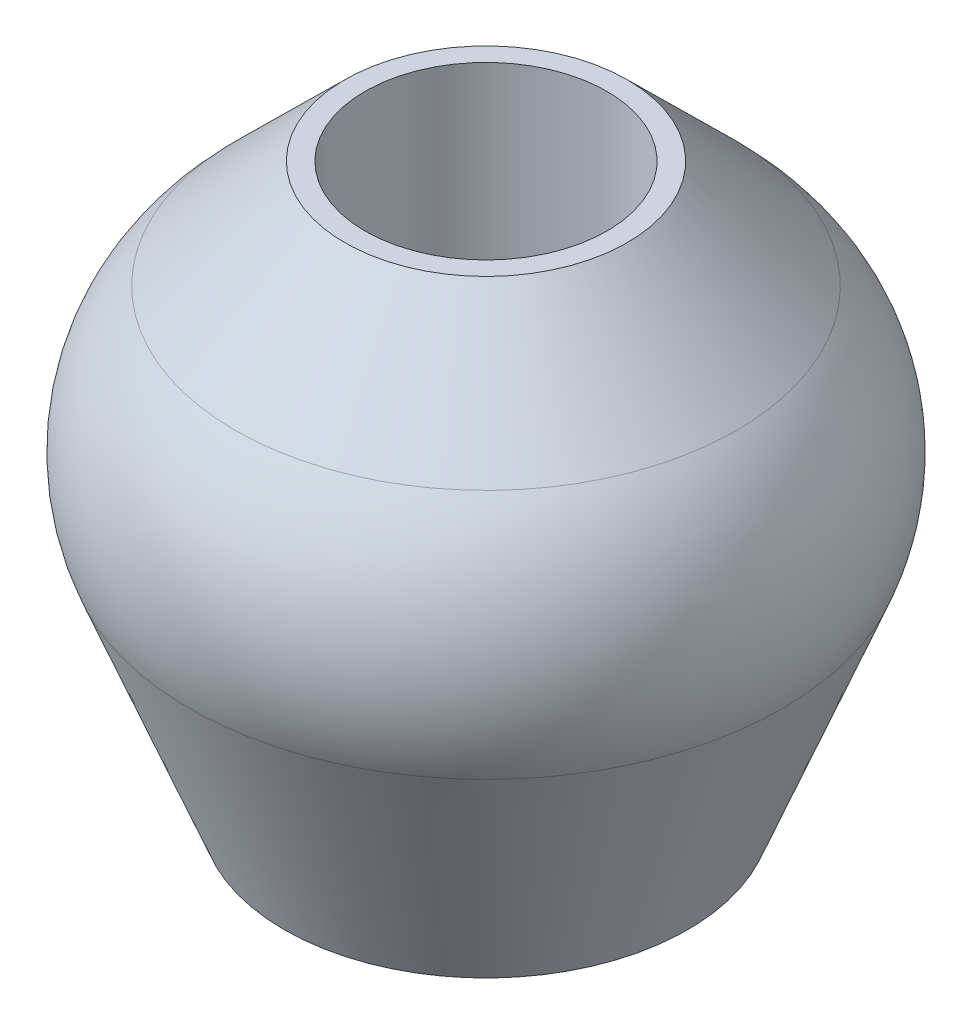
ISO-10303-21;
HEADER;
FILE_DESCRIPTION(('STEP AP214'),'2;1');
FILE_NAME('part.step','',(''),(''),'','','');
FILE_SCHEMA(('AUTOMOTIVE_DESIGN { 1 0 10303 214 1 1 1 1 }'));
ENDSEC;
DATA;
#1=APPLICATION_CONTEXT('core data for automotive mechanical design processes');
#2=APPLICATION_PROTOCOL_DEFINITION('international standard','automotive_design',2000,#1);
#3=PRODUCT_CONTEXT('',#1,'mechanical');
#4=PRODUCT('Part','Part','',(#3));
#5=PRODUCT_RELATED_PRODUCT_CATEGORY('part','',(#4));
#6=PRODUCT_DEFINITION_FORMATION('','',#4);
#7=PRODUCT_DEFINITION_CONTEXT('part definition',#1,'design');
#8=PRODUCT_DEFINITION('design','',#6,#7);
#9=PRODUCT_DEFINITION_SHAPE('','',#8);
#10=(LENGTH_UNIT() NAMED_UNIT(*) SI_UNIT(.MILLI.,.METRE.));
#11=(NAMED_UNIT(*) PLANE_ANGLE_UNIT() SI_UNIT($,.RADIAN.));
#12=(NAMED_UNIT(*) SI_UNIT($,.STERADIAN.) SOLID_ANGLE_UNIT());
#13=UNCERTAINTY_MEASURE_WITH_UNIT(LENGTH_MEASURE(1.E-05),#10,'distance_accuracy_value','');
#14=(GEOMETRIC_REPRESENTATION_CONTEXT(3) GLOBAL_UNCERTAINTY_ASSIGNED_CONTEXT((#13)) GLOBAL_UNIT_ASSIGNED_CONTEXT((#10,
#11,#12)) REPRESENTATION_CONTEXT('',''));
#15=CARTESIAN_POINT('',(0.,0.,0.));
#16=DIRECTION('',(0.,0.,1.));
#17=DIRECTION('',(1.,0.,0.));
#18=AXIS2_PLACEMENT_3D('',#15,#16,#17);
#19=CARTESIAN_POINT('',(0.,0.,0.));
#20=DIRECTION('',(0.,-1.,0.));
#21=DIRECTION('',(0.,0.,-1.));
#22=AXIS2_PLACEMENT_3D('',#19,#20,#21);
#23=PLANE('',#22);
#24=CARTESIAN_POINT('',(0.,0.,0.));
#25=DIRECTION('',(0.,-1.,0.));
#26=DIRECTION('',(0.,0.,-1.));
#27=AXIS2_PLACEMENT_3D('',#24,#25,#26);
#28=CIRCLE('',#27,5.);
#29=CARTESIAN_POINT('',(0.,0.,-5.));
#30=VERTEX_POINT('',#29);
#31=EDGE_CURVE('E43',#30,#30,#28,.T.);
#32=ORIENTED_EDGE('',*,*,#31,.T.);
#33=EDGE_LOOP('',(#32));
#34=FACE_BOUND('',#33,.T.);
#35=ADVANCED_FACE('F32',(#34),#23,.T.);
#36=CARTESIAN_POINT('',(0.,0.,0.));
#37=DIRECTION('',(0.,1.,0.));
#38=DIRECTION('',(0.,0.,1.));
#39=AXIS2_PLACEMENT_3D('',#36,#37,#38);
#40=CONICAL_SURFACE('',#39,5.,0.377329460919805);
#41=CARTESIAN_POINT('',(0.,5.92338421681027,0.));
#42=DIRECTION('',(0.,-1.,0.));
#43=DIRECTION('',(0.,0.,-1.));
#44=AXIS2_PLACEMENT_3D('',#41,#42,#43);
#45=CIRCLE('',#44,7.34755232734471);
#46=CARTESIAN_POINT('',(0.,5.92338421681027,-7.34755232734471));
#47=VERTEX_POINT('',#46);
#48=EDGE_CURVE('E39',#47,#47,#45,.T.);
#49=ORIENTED_EDGE('',*,*,#48,.T.);
#50=EDGE_LOOP('',(#49));
#51=FACE_BOUND('',#50,.T.);
#52=ORIENTED_EDGE('',*,*,#31,.F.);
#53=EDGE_LOOP('',(#52));
#54=FACE_BOUND('',#53,.T.);
#55=ADVANCED_FACE('F70',(#51,#54),#40,.T.);
#56=CARTESIAN_POINT('',(0.,9.,0.));
#57=DIRECTION('',(0.,-1.,0.));
#58=DIRECTION('',(0.,0.,-1.));
#59=AXIS2_PLACEMENT_3D('',#56,#57,#58);
#60=CONICAL_SURFACE('',#59,8.56687497767615,0.792041137916399);
#61=CARTESIAN_POINT('',(0.,11.3245219744482,0.));
#62=DIRECTION('',(0.,1.,0.));
#63=DIRECTION('',(0.,0.,1.));
#64=AXIS2_PLACEMENT_3D('',#61,#62,#63);
#65=CIRCLE('',#64,6.21126253219815);
#66=CARTESIAN_POINT('',(0.,11.3245219744482,6.21126253219815));
#67=VERTEX_POINT('',#66);
#68=EDGE_CURVE('E10',#67,#67,#65,.T.);
#69=ORIENTED_EDGE('',*,*,#68,.T.);
#70=EDGE_LOOP('',(#69));
#71=FACE_BOUND('',#70,.T.);
#72=CARTESIAN_POINT('',(0.,14.,0.));
#73=DIRECTION('',(0.,-1.,0.));
#74=DIRECTION('',(0.,0.,-1.));
#75=AXIS2_PLACEMENT_3D('',#72,#73,#74);
#76=CIRCLE('',#75,3.5);
#77=CARTESIAN_POINT('',(0.,14.,-3.5));
#78=VERTEX_POINT('',#77);
#79=EDGE_CURVE('E47',#78,#78,#76,.T.);
#80=ORIENTED_EDGE('',*,*,#79,.T.);
#81=EDGE_LOOP('',(#80));
#82=FACE_BOUND('',#81,.T.);
#83=ADVANCED_FACE('F65',(#71,#82),#60,.T.);
#84=CARTESIAN_POINT('',(0.,14.,-3.5));
#85=DIRECTION('',(0.,1.,0.));
#86=DIRECTION('',(0.,0.,1.));
#87=AXIS2_PLACEMENT_3D('',#84,#85,#86);
#88=PLANE('',#87);
#89=CARTESIAN_POINT('',(0.,14.,0.));
#90=DIRECTION('',(0.,1.,0.));
#91=DIRECTION('',(0.,0.,1.));
#92=AXIS2_PLACEMENT_3D('',#89,#90,#91);
#93=CIRCLE('',#92,3.);
#94=CARTESIAN_POINT('',(0.,14.,3.));
#95=VERTEX_POINT('',#94);
#96=EDGE_CURVE('E55',#95,#95,#93,.T.);
#97=ORIENTED_EDGE('',*,*,#96,.F.);
#98=EDGE_LOOP('',(#97));
#99=FACE_BOUND('',#98,.T.);
#100=ORIENTED_EDGE('',*,*,#79,.F.);
#101=EDGE_LOOP('',(#100));
#102=FACE_BOUND('',#101,.T.);
#103=ADVANCED_FACE('F61',(#99,#102),#88,.T.);
#104=CARTESIAN_POINT('',(0.,4.25,0.));
#105=DIRECTION('',(0.,-1.,0.));
#106=DIRECTION('',(0.,0.,-1.));
#107=AXIS2_PLACEMENT_3D('',#104,#105,#106);
#108=PLANE('',#107);
#109=CARTESIAN_POINT('',(0.,4.25,0.));
#110=DIRECTION('',(0.,1.,0.));
#111=DIRECTION('',(0.,0.,1.));
#112=AXIS2_PLACEMENT_3D('',#109,#110,#111);
#113=CIRCLE('',#112,3.);
#114=CARTESIAN_POINT('',(0.,4.25,3.));
#115=VERTEX_POINT('',#114);
#116=EDGE_CURVE('E52',#115,#115,#113,.T.);
#117=ORIENTED_EDGE('',*,*,#116,.T.);
#118=EDGE_LOOP('',(#117));
#119=FACE_BOUND('',#118,.T.);
#120=ADVANCED_FACE('F64',(#119),#108,.F.);
#121=CARTESIAN_POINT('',(0.,14.,0.));
#122=DIRECTION('',(0.,1.,0.));
#123=DIRECTION('',(0.,0.,1.));
#124=AXIS2_PLACEMENT_3D('',#121,#122,#123);
#125=CYLINDRICAL_SURFACE('',#124,3.);
#126=ORIENTED_EDGE('',*,*,#116,.F.);
#127=EDGE_LOOP('',(#126));
#128=FACE_BOUND('',#127,.T.);
#129=ORIENTED_EDGE('',*,*,#96,.T.);
#130=EDGE_LOOP('',(#129));
#131=FACE_BOUND('',#130,.T.);
#132=ADVANCED_FACE('F59',(#128,#131),#125,.F.);
#133=CARTESIAN_POINT('',(0.,7.7655797893028,0.));
#134=DIRECTION('',(0.,1.,0.));
#135=DIRECTION('',(0.,0.,1.));
#136=AXIS2_PLACEMENT_3D('',#133,#134,#135);
#137=DEGENERATE_TOROIDAL_SURFACE('',#136,2.6992929248706,5.,.T.);
#138=ORIENTED_EDGE('',*,*,#68,.F.);
#139=EDGE_LOOP('',(#138));
#140=FACE_BOUND('',#139,.T.);
#141=ORIENTED_EDGE('',*,*,#48,.F.);
#142=EDGE_LOOP('',(#141));
#143=FACE_BOUND('',#142,.T.);
#144=ADVANCED_FACE('F34',(#140,#143),#137,.T.);
#145=CLOSED_SHELL('',(#35,#55,#83,#103,#120,#132,#144));
#146=MANIFOLD_SOLID_BREP('B2',#145);
#147=ADVANCED_BREP_SHAPE_REPRESENTATION('',(#18,#146),#14);
#148=SHAPE_DEFINITION_REPRESENTATION(#9,#147);
ENDSEC;
END-ISO-10303-21;
